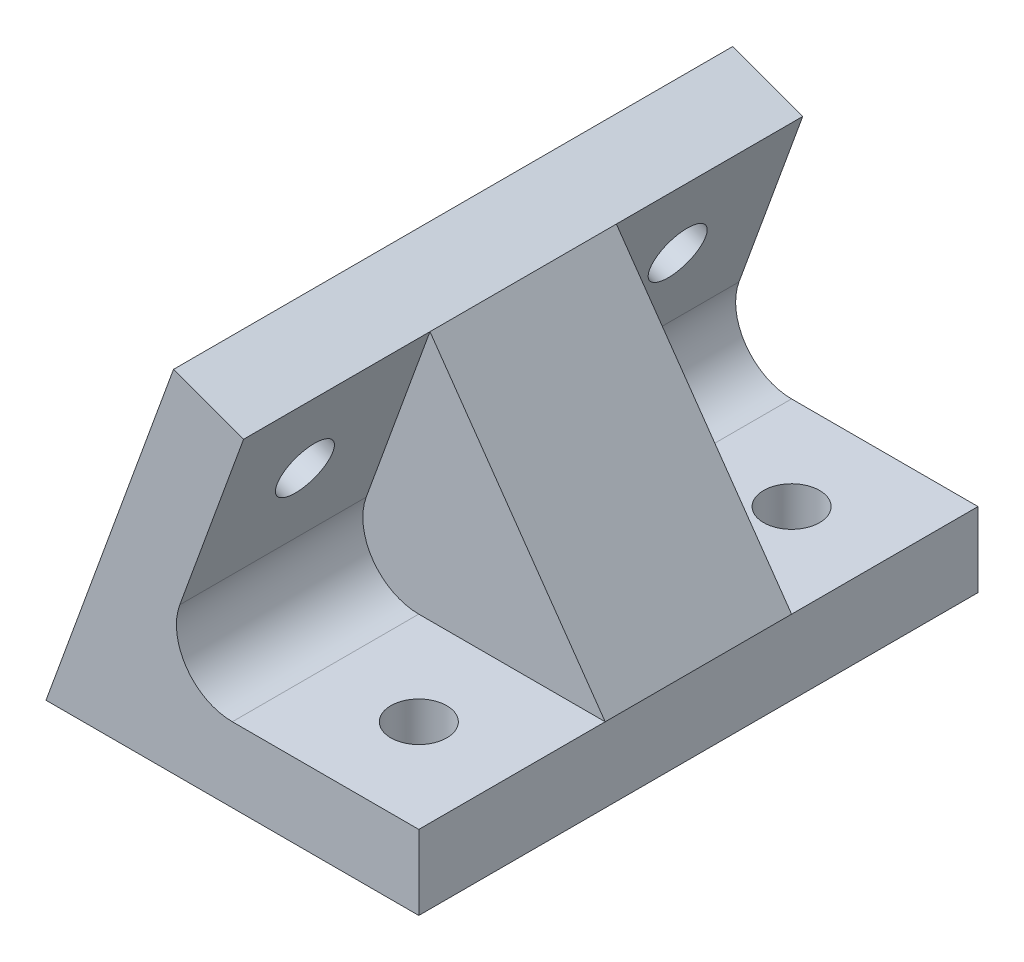
ISO-10303-21;
HEADER;
FILE_DESCRIPTION(('STEP AP214'),'2;1');
FILE_NAME('part.step','',(''),(''),'','','');
FILE_SCHEMA(('AUTOMOTIVE_DESIGN { 1 0 10303 214 1 1 1 1 }'));
ENDSEC;
DATA;
#1=APPLICATION_CONTEXT('core data for automotive mechanical design processes');
#2=APPLICATION_PROTOCOL_DEFINITION('international standard','automotive_design',2000,#1);
#3=PRODUCT_CONTEXT('',#1,'mechanical');
#4=PRODUCT('Part','Part','',(#3));
#5=PRODUCT_RELATED_PRODUCT_CATEGORY('part','',(#4));
#6=PRODUCT_DEFINITION_FORMATION('','',#4);
#7=PRODUCT_DEFINITION_CONTEXT('part definition',#1,'design');
#8=PRODUCT_DEFINITION('design','',#6,#7);
#9=PRODUCT_DEFINITION_SHAPE('','',#8);
#10=(LENGTH_UNIT() NAMED_UNIT(*) SI_UNIT(.MILLI.,.METRE.));
#11=(NAMED_UNIT(*) PLANE_ANGLE_UNIT() SI_UNIT($,.RADIAN.));
#12=(NAMED_UNIT(*) SI_UNIT($,.STERADIAN.) SOLID_ANGLE_UNIT());
#13=UNCERTAINTY_MEASURE_WITH_UNIT(LENGTH_MEASURE(1.E-05),#10,'distance_accuracy_value','');
#14=(GEOMETRIC_REPRESENTATION_CONTEXT(3) GLOBAL_UNCERTAINTY_ASSIGNED_CONTEXT((#13)) GLOBAL_UNIT_ASSIGNED_CONTEXT((#10,
#11,#12)) REPRESENTATION_CONTEXT('',''));
#15=CARTESIAN_POINT('',(0.,0.,0.));
#16=DIRECTION('',(0.,0.,1.));
#17=DIRECTION('',(1.,0.,0.));
#18=AXIS2_PLACEMENT_3D('',#15,#16,#17);
#19=CARTESIAN_POINT('',(20.,4.,30.));
#20=DIRECTION('',(0.,-1.,0.));
#21=DIRECTION('',(1.,0.,0.));
#22=AXIS2_PLACEMENT_3D('',#19,#20,#21);
#23=PLANE('',#22);
#24=CARTESIAN_POINT('',(15.,4.,5.));
#25=DIRECTION('',(0.,-1.,0.));
#26=DIRECTION('',(1.,0.,0.));
#27=AXIS2_PLACEMENT_3D('',#24,#25,#26);
#28=CIRCLE('',#27,1.5);
#29=CARTESIAN_POINT('',(16.5,4.,5.));
#30=VERTEX_POINT('',#29);
#31=EDGE_CURVE('E182',#30,#30,#28,.T.);
#32=ORIENTED_EDGE('',*,*,#31,.T.);
#33=EDGE_LOOP('',(#32));
#34=FACE_BOUND('',#33,.T.);
#35=DIRECTION('',(-1.,0.,0.));
#36=VECTOR('',#35,1.);
#37=CARTESIAN_POINT('',(20.,4.,0.));
#38=LINE('',#37,#36);
#39=CARTESIAN_POINT('',(20.,4.,0.));
#40=VERTEX_POINT('',#39);
#41=CARTESIAN_POINT('',(9.99703604719484,4.,0.));
#42=VERTEX_POINT('',#41);
#43=EDGE_CURVE('E222',#40,#42,#38,.T.);
#44=ORIENTED_EDGE('',*,*,#43,.T.);
#45=DIRECTION('',(0.,0.,-1.));
#46=VECTOR('',#45,1.);
#47=CARTESIAN_POINT('',(9.99703604719484,4.,10.));
#48=LINE('',#47,#46);
#49=CARTESIAN_POINT('',(9.99703604719484,4.,10.));
#50=VERTEX_POINT('',#49);
#51=EDGE_CURVE('E155',#42,#50,#48,.F.);
#52=ORIENTED_EDGE('',*,*,#51,.T.);
#53=DIRECTION('',(-1.,0.,0.));
#54=VECTOR('',#53,1.);
#55=CARTESIAN_POINT('',(20.,4.,10.));
#56=LINE('',#55,#54);
#57=CARTESIAN_POINT('',(20.,4.,10.));
#58=VERTEX_POINT('',#57);
#59=EDGE_CURVE('E144',#58,#50,#56,.T.);
#60=ORIENTED_EDGE('',*,*,#59,.F.);
#61=DIRECTION('',(0.,0.,-1.));
#62=VECTOR('',#61,1.);
#63=CARTESIAN_POINT('',(20.,4.,30.));
#64=LINE('',#63,#62);
#65=EDGE_CURVE('E152',#58,#40,#64,.T.);
#66=ORIENTED_EDGE('',*,*,#65,.T.);
#67=EDGE_LOOP('',(#44,#52,#60,#66));
#68=FACE_BOUND('',#67,.T.);
#69=ADVANCED_FACE('F39',(#34,#68),#23,.F.);
#70=CARTESIAN_POINT('',(5.71259202696848,4.,30.));
#71=DIRECTION('',(-0.939692620785907,0.342020143325673,0.));
#72=DIRECTION('',(-0.342020143325673,-0.939692620785907,0.));
#73=AXIS2_PLACEMENT_3D('',#70,#71,#72);
#74=PLANE('',#73);
#75=CARTESIAN_POINT('',(8.88907263302871,12.7273087384859,5.));
#76=DIRECTION('',(-0.939692620785907,0.342020143325673,0.));
#77=DIRECTION('',(-0.342020143325673,-0.939692620785907,0.));
#78=AXIS2_PLACEMENT_3D('',#75,#76,#77);
#79=CIRCLE('',#78,1.5);
#80=CARTESIAN_POINT('',(8.37604241804021,11.3177698073071,5.));
#81=VERTEX_POINT('',#80);
#82=EDGE_CURVE('E192',#81,#81,#79,.F.);
#83=ORIENTED_EDGE('',*,*,#82,.F.);
#84=EDGE_LOOP('',(#83));
#85=FACE_BOUND('',#84,.T.);
#86=DIRECTION('',(0.342020143325673,0.939692620785907,0.));
#87=VECTOR('',#86,1.);
#88=CARTESIAN_POINT('',(5.71259202696848,4.,10.));
#89=LINE('',#88,#87);
#90=CARTESIAN_POINT('',(7.17795818483712,8.02606042997701,10.));
#91=VERTEX_POINT('',#90);
#92=CARTESIAN_POINT('',(10.5991733496571,17.4257718424155,10.));
#93=VERTEX_POINT('',#92);
#94=EDGE_CURVE('E147',#91,#93,#89,.T.);
#95=ORIENTED_EDGE('',*,*,#94,.F.);
#96=DIRECTION('',(0.,0.,-1.));
#97=VECTOR('',#96,1.);
#98=CARTESIAN_POINT('',(7.17795818483712,8.02606042997701,0.));
#99=LINE('',#98,#97);
#100=CARTESIAN_POINT('',(7.17795818483712,8.02606042997701,0.));
#101=VERTEX_POINT('',#100);
#102=EDGE_CURVE('E181',#91,#101,#99,.T.);
#103=ORIENTED_EDGE('',*,*,#102,.T.);
#104=DIRECTION('',(0.342020143325673,0.939692620785907,0.));
#105=VECTOR('',#104,1.);
#106=CARTESIAN_POINT('',(5.71259202696848,4.,0.));
#107=LINE('',#106,#105);
#108=CARTESIAN_POINT('',(10.5991733496571,17.4257718424155,0.));
#109=VERTEX_POINT('',#108);
#110=EDGE_CURVE('E224',#101,#109,#107,.T.);
#111=ORIENTED_EDGE('',*,*,#110,.T.);
#112=DIRECTION('',(0.,0.,-1.));
#113=VECTOR('',#112,1.);
#114=CARTESIAN_POINT('',(10.5991733496571,17.4257718424155,30.));
#115=LINE('',#114,#113);
#116=EDGE_CURVE('E173',#93,#109,#115,.T.);
#117=ORIENTED_EDGE('',*,*,#116,.F.);
#118=EDGE_LOOP('',(#95,#103,#111,#117));
#119=FACE_BOUND('',#118,.T.);
#120=ADVANCED_FACE('F231',(#85,#119),#74,.F.);
#121=CARTESIAN_POINT('',(6.84040286651345,18.7938524157181,30.));
#122=DIRECTION('',(0.939692620785907,-0.342020143325672,0.));
#123=DIRECTION('',(0.342020143325672,0.939692620785907,0.));
#124=AXIS2_PLACEMENT_3D('',#121,#122,#123);
#125=PLANE('',#124);
#126=CARTESIAN_POINT('',(5.13030214988509,14.0953893117886,25.));
#127=DIRECTION('',(0.939692620785907,-0.342020143325672,0.));
#128=DIRECTION('',(0.,0.,-1.));
#129=AXIS2_PLACEMENT_3D('',#126,#127,#128);
#130=CIRCLE('',#129,1.5);
#131=CARTESIAN_POINT('',(5.13030214988509,14.0953893117886,23.5));
#132=VERTEX_POINT('',#131);
#133=EDGE_CURVE('E197',#132,#132,#130,.T.);
#134=ORIENTED_EDGE('',*,*,#133,.T.);
#135=EDGE_LOOP('',(#134));
#136=FACE_BOUND('',#135,.T.);
#137=DIRECTION('',(0.,0.,-1.));
#138=VECTOR('',#137,1.);
#139=CARTESIAN_POINT('',(6.84040286651345,18.7938524157181,30.));
#140=LINE('',#139,#138);
#141=CARTESIAN_POINT('',(6.84040286651345,18.7938524157181,30.));
#142=VERTEX_POINT('',#141);
#143=CARTESIAN_POINT('',(6.84040286651345,18.7938524157181,0.));
#144=VERTEX_POINT('',#143);
#145=EDGE_CURVE('E275',#142,#144,#140,.T.);
#146=ORIENTED_EDGE('',*,*,#145,.T.);
#147=DIRECTION('',(-0.342020143325672,-0.939692620785907,0.));
#148=VECTOR('',#147,1.);
#149=CARTESIAN_POINT('',(6.84040286651345,18.7938524157181,0.));
#150=LINE('',#149,#148);
#151=CARTESIAN_POINT('',(0.,0.,0.));
#152=VERTEX_POINT('',#151);
#153=EDGE_CURVE('E191',#144,#152,#150,.T.);
#154=ORIENTED_EDGE('',*,*,#153,.T.);
#155=DIRECTION('',(0.,0.,-1.));
#156=VECTOR('',#155,1.);
#157=CARTESIAN_POINT('',(0.,0.,30.));
#158=LINE('',#157,#156);
#159=CARTESIAN_POINT('',(0.,0.,30.));
#160=VERTEX_POINT('',#159);
#161=EDGE_CURVE('E178',#160,#152,#158,.T.);
#162=ORIENTED_EDGE('',*,*,#161,.F.);
#163=DIRECTION('',(-0.342020143325672,-0.939692620785907,0.));
#164=VECTOR('',#163,1.);
#165=CARTESIAN_POINT('',(6.84040286651345,18.7938524157181,30.));
#166=LINE('',#165,#164);
#167=EDGE_CURVE('E255',#142,#160,#166,.T.);
#168=ORIENTED_EDGE('',*,*,#167,.F.);
#169=EDGE_LOOP('',(#146,#154,#162,#168));
#170=FACE_BOUND('',#169,.T.);
#171=CARTESIAN_POINT('',(5.13030214988509,14.0953893117886,5.));
#172=DIRECTION('',(0.939692620785907,-0.342020143325672,0.));
#173=DIRECTION('',(0.,0.,1.));
#174=AXIS2_PLACEMENT_3D('',#171,#172,#173);
#175=CIRCLE('',#174,1.5);
#176=CARTESIAN_POINT('',(5.13030214988509,14.0953893117886,6.5));
#177=VERTEX_POINT('',#176);
#178=EDGE_CURVE('E137',#177,#177,#175,.T.);
#179=ORIENTED_EDGE('',*,*,#178,.T.);
#180=EDGE_LOOP('',(#179));
#181=FACE_BOUND('',#180,.T.);
#182=ADVANCED_FACE('F311',(#136,#170,#181),#125,.F.);
#183=CARTESIAN_POINT('',(0.,0.,30.));
#184=DIRECTION('',(0.,1.,0.));
#185=DIRECTION('',(0.,0.,1.));
#186=AXIS2_PLACEMENT_3D('',#183,#184,#185);
#187=PLANE('',#186);
#188=CARTESIAN_POINT('',(15.,0.,25.));
#189=DIRECTION('',(0.,-1.,0.));
#190=DIRECTION('',(0.,0.,-1.));
#191=AXIS2_PLACEMENT_3D('',#188,#189,#190);
#192=CIRCLE('',#191,1.5);
#193=CARTESIAN_POINT('',(15.,0.,23.5));
#194=VERTEX_POINT('',#193);
#195=EDGE_CURVE('E187',#194,#194,#192,.T.);
#196=ORIENTED_EDGE('',*,*,#195,.F.);
#197=EDGE_LOOP('',(#196));
#198=FACE_BOUND('',#197,.T.);
#199=ORIENTED_EDGE('',*,*,#161,.T.);
#200=DIRECTION('',(1.,0.,0.));
#201=VECTOR('',#200,1.);
#202=CARTESIAN_POINT('',(0.,0.,0.));
#203=LINE('',#202,#201);
#204=CARTESIAN_POINT('',(20.,0.,0.));
#205=VERTEX_POINT('',#204);
#206=EDGE_CURVE('E279',#152,#205,#203,.T.);
#207=ORIENTED_EDGE('',*,*,#206,.T.);
#208=DIRECTION('',(0.,0.,-1.));
#209=VECTOR('',#208,1.);
#210=CARTESIAN_POINT('',(20.,0.,30.));
#211=LINE('',#210,#209);
#212=CARTESIAN_POINT('',(20.,0.,30.));
#213=VERTEX_POINT('',#212);
#214=EDGE_CURVE('E169',#213,#205,#211,.T.);
#215=ORIENTED_EDGE('',*,*,#214,.F.);
#216=DIRECTION('',(1.,0.,0.));
#217=VECTOR('',#216,1.);
#218=CARTESIAN_POINT('',(0.,0.,30.));
#219=LINE('',#218,#217);
#220=EDGE_CURVE('E259',#160,#213,#219,.T.);
#221=ORIENTED_EDGE('',*,*,#220,.F.);
#222=EDGE_LOOP('',(#199,#207,#215,#221));
#223=FACE_BOUND('',#222,.T.);
#224=CARTESIAN_POINT('',(15.,0.,5.));
#225=DIRECTION('',(0.,-1.,0.));
#226=DIRECTION('',(0.,0.,1.));
#227=AXIS2_PLACEMENT_3D('',#224,#225,#226);
#228=CIRCLE('',#227,1.5);
#229=CARTESIAN_POINT('',(15.,0.,6.5));
#230=VERTEX_POINT('',#229);
#231=EDGE_CURVE('E201',#230,#230,#228,.T.);
#232=ORIENTED_EDGE('',*,*,#231,.F.);
#233=EDGE_LOOP('',(#232));
#234=FACE_BOUND('',#233,.T.);
#235=ADVANCED_FACE('F315',(#198,#223,#234),#187,.F.);
#236=CARTESIAN_POINT('',(20.,0.,30.));
#237=DIRECTION('',(-1.,0.,0.));
#238=DIRECTION('',(0.,0.,1.));
#239=AXIS2_PLACEMENT_3D('',#236,#237,#238);
#240=PLANE('',#239);
#241=ORIENTED_EDGE('',*,*,#214,.T.);
#242=DIRECTION('',(0.,1.,0.));
#243=VECTOR('',#242,1.);
#244=CARTESIAN_POINT('',(20.,0.,0.));
#245=LINE('',#244,#243);
#246=EDGE_CURVE('E161',#205,#40,#245,.T.);
#247=ORIENTED_EDGE('',*,*,#246,.T.);
#248=ORIENTED_EDGE('',*,*,#65,.F.);
#249=DIRECTION('',(0.,0.,-1.));
#250=VECTOR('',#249,1.);
#251=CARTESIAN_POINT('',(20.,4.,30.));
#252=LINE('',#251,#250);
#253=CARTESIAN_POINT('',(20.,4.,20.));
#254=VERTEX_POINT('',#253);
#255=EDGE_CURVE('E124',#58,#254,#252,.F.);
#256=ORIENTED_EDGE('',*,*,#255,.T.);
#257=CARTESIAN_POINT('',(20.,4.,30.));
#258=VERTEX_POINT('',#257);
#259=EDGE_CURVE('E164',#258,#254,#64,.T.);
#260=ORIENTED_EDGE('',*,*,#259,.F.);
#261=DIRECTION('',(0.,1.,0.));
#262=VECTOR('',#261,1.);
#263=CARTESIAN_POINT('',(20.,0.,30.));
#264=LINE('',#263,#262);
#265=EDGE_CURVE('E263',#213,#258,#264,.T.);
#266=ORIENTED_EDGE('',*,*,#265,.F.);
#267=EDGE_LOOP('',(#241,#247,#248,#256,#260,#266));
#268=FACE_BOUND('',#267,.T.);
#269=ADVANCED_FACE('F159',(#268),#240,.F.);
#270=CARTESIAN_POINT('',(15.,4.,25.));
#271=DIRECTION('',(0.,-1.,0.));
#272=DIRECTION('',(1.,0.,0.));
#273=AXIS2_PLACEMENT_3D('',#270,#271,#272);
#274=CIRCLE('',#273,1.5);
#275=CARTESIAN_POINT('',(16.5,4.,25.));
#276=VERTEX_POINT('',#275);
#277=EDGE_CURVE('E186',#276,#276,#274,.T.);
#278=ORIENTED_EDGE('',*,*,#277,.T.);
#279=EDGE_LOOP('',(#278));
#280=FACE_BOUND('',#279,.T.);
#281=DIRECTION('',(-1.,0.,0.));
#282=VECTOR('',#281,1.);
#283=CARTESIAN_POINT('',(20.,4.,20.));
#284=LINE('',#283,#282);
#285=CARTESIAN_POINT('',(9.99703604719484,4.,20.));
#286=VERTEX_POINT('',#285);
#287=EDGE_CURVE('E138',#254,#286,#284,.T.);
#288=ORIENTED_EDGE('',*,*,#287,.T.);
#289=DIRECTION('',(0.,0.,-1.));
#290=VECTOR('',#289,1.);
#291=CARTESIAN_POINT('',(9.99703604719484,4.,30.));
#292=LINE('',#291,#290);
#293=CARTESIAN_POINT('',(9.99703604719484,4.,30.));
#294=VERTEX_POINT('',#293);
#295=EDGE_CURVE('E55',#286,#294,#292,.F.);
#296=ORIENTED_EDGE('',*,*,#295,.T.);
#297=DIRECTION('',(-1.,0.,0.));
#298=VECTOR('',#297,1.);
#299=CARTESIAN_POINT('',(20.,4.,30.));
#300=LINE('',#299,#298);
#301=EDGE_CURVE('E266',#258,#294,#300,.T.);
#302=ORIENTED_EDGE('',*,*,#301,.F.);
#303=ORIENTED_EDGE('',*,*,#259,.T.);
#304=EDGE_LOOP('',(#288,#296,#302,#303));
#305=FACE_BOUND('',#304,.T.);
#306=ADVANCED_FACE('F300',(#280,#305),#23,.F.);
#307=CARTESIAN_POINT('',(8.88907263302871,12.7273087384859,25.));
#308=DIRECTION('',(-0.939692620785907,0.342020143325673,0.));
#309=DIRECTION('',(-0.342020143325673,-0.939692620785907,0.));
#310=AXIS2_PLACEMENT_3D('',#307,#308,#309);
#311=CIRCLE('',#310,1.5);
#312=CARTESIAN_POINT('',(8.37604241804021,11.3177698073071,25.));
#313=VERTEX_POINT('',#312);
#314=EDGE_CURVE('E196',#313,#313,#311,.F.);
#315=ORIENTED_EDGE('',*,*,#314,.F.);
#316=EDGE_LOOP('',(#315));
#317=FACE_BOUND('',#316,.T.);
#318=DIRECTION('',(0.342020143325673,0.939692620785907,0.));
#319=VECTOR('',#318,1.);
#320=CARTESIAN_POINT('',(5.71259202696848,4.,30.));
#321=LINE('',#320,#319);
#322=CARTESIAN_POINT('',(7.17795818483712,8.02606042997701,30.));
#323=VERTEX_POINT('',#322);
#324=CARTESIAN_POINT('',(10.5991733496571,17.4257718424155,30.));
#325=VERTEX_POINT('',#324);
#326=EDGE_CURVE('E269',#323,#325,#321,.T.);
#327=ORIENTED_EDGE('',*,*,#326,.F.);
#328=DIRECTION('',(0.,0.,-1.));
#329=VECTOR('',#328,1.);
#330=CARTESIAN_POINT('',(7.17795818483712,8.02606042997701,20.));
#331=LINE('',#330,#329);
#332=CARTESIAN_POINT('',(7.17795818483712,8.02606042997701,20.));
#333=VERTEX_POINT('',#332);
#334=EDGE_CURVE('E210',#323,#333,#331,.T.);
#335=ORIENTED_EDGE('',*,*,#334,.T.);
#336=DIRECTION('',(0.342020143325673,0.939692620785907,0.));
#337=VECTOR('',#336,1.);
#338=CARTESIAN_POINT('',(5.71259202696848,4.,20.));
#339=LINE('',#338,#337);
#340=CARTESIAN_POINT('',(10.5991733496571,17.4257718424155,20.));
#341=VERTEX_POINT('',#340);
#342=EDGE_CURVE('E157',#333,#341,#339,.T.);
#343=ORIENTED_EDGE('',*,*,#342,.T.);
#344=EDGE_CURVE('E165',#325,#341,#115,.T.);
#345=ORIENTED_EDGE('',*,*,#344,.F.);
#346=EDGE_LOOP('',(#327,#335,#343,#345));
#347=FACE_BOUND('',#346,.T.);
#348=ADVANCED_FACE('F308',(#317,#347),#74,.F.);
#349=CARTESIAN_POINT('',(10.5991733496571,17.4257718424155,30.));
#350=DIRECTION('',(-0.342020143325673,-0.939692620785907,0.));
#351=DIRECTION('',(0.939692620785907,-0.342020143325673,0.));
#352=AXIS2_PLACEMENT_3D('',#349,#350,#351);
#353=PLANE('',#352);
#354=ORIENTED_EDGE('',*,*,#344,.T.);
#355=EDGE_CURVE('E171',#341,#93,#115,.T.);
#356=ORIENTED_EDGE('',*,*,#355,.T.);
#357=ORIENTED_EDGE('',*,*,#116,.T.);
#358=DIRECTION('',(-0.939692620785907,0.342020143325673,0.));
#359=VECTOR('',#358,1.);
#360=CARTESIAN_POINT('',(10.5991733496571,17.4257718424155,0.));
#361=LINE('',#360,#359);
#362=EDGE_CURVE('E260',#109,#144,#361,.T.);
#363=ORIENTED_EDGE('',*,*,#362,.T.);
#364=ORIENTED_EDGE('',*,*,#145,.F.);
#365=DIRECTION('',(-0.939692620785907,0.342020143325673,0.));
#366=VECTOR('',#365,1.);
#367=CARTESIAN_POINT('',(10.5991733496571,17.4257718424155,30.));
#368=LINE('',#367,#366);
#369=EDGE_CURVE('E272',#325,#142,#368,.T.);
#370=ORIENTED_EDGE('',*,*,#369,.F.);
#371=EDGE_LOOP('',(#354,#356,#357,#363,#364,#370));
#372=FACE_BOUND('',#371,.T.);
#373=ADVANCED_FACE('F296',(#372),#353,.F.);
#374=CARTESIAN_POINT('',(0.,0.,30.));
#375=DIRECTION('',(0.,0.,-1.));
#376=DIRECTION('',(-1.,0.,0.));
#377=AXIS2_PLACEMENT_3D('',#374,#375,#376);
#378=PLANE('',#377);
#379=ORIENTED_EDGE('',*,*,#167,.T.);
#380=ORIENTED_EDGE('',*,*,#220,.T.);
#381=ORIENTED_EDGE('',*,*,#265,.T.);
#382=ORIENTED_EDGE('',*,*,#301,.T.);
#383=CARTESIAN_POINT('',(9.99703604719484,7.,30.));
#384=DIRECTION('',(0.,0.,-1.));
#385=DIRECTION('',(-1.,0.,0.));
#386=AXIS2_PLACEMENT_3D('',#383,#384,#385);
#387=CIRCLE('',#386,3.);
#388=EDGE_CURVE('E11',#294,#323,#387,.T.);
#389=ORIENTED_EDGE('',*,*,#388,.T.);
#390=ORIENTED_EDGE('',*,*,#326,.T.);
#391=ORIENTED_EDGE('',*,*,#369,.T.);
#392=EDGE_LOOP('',(#379,#380,#381,#382,#389,#390,#391));
#393=FACE_BOUND('',#392,.T.);
#394=ADVANCED_FACE('F306',(#393),#378,.F.);
#395=CARTESIAN_POINT('',(0.,0.,0.));
#396=DIRECTION('',(0.,0.,-1.));
#397=DIRECTION('',(-1.,0.,0.));
#398=AXIS2_PLACEMENT_3D('',#395,#396,#397);
#399=PLANE('',#398);
#400=ORIENTED_EDGE('',*,*,#153,.F.);
#401=ORIENTED_EDGE('',*,*,#362,.F.);
#402=ORIENTED_EDGE('',*,*,#110,.F.);
#403=CARTESIAN_POINT('',(9.99703604719484,7.,0.));
#404=DIRECTION('',(0.,0.,-1.));
#405=DIRECTION('',(-1.,0.,0.));
#406=AXIS2_PLACEMENT_3D('',#403,#404,#405);
#407=CIRCLE('',#406,3.);
#408=EDGE_CURVE('E48',#101,#42,#407,.F.);
#409=ORIENTED_EDGE('',*,*,#408,.T.);
#410=ORIENTED_EDGE('',*,*,#43,.F.);
#411=ORIENTED_EDGE('',*,*,#246,.F.);
#412=ORIENTED_EDGE('',*,*,#206,.F.);
#413=EDGE_LOOP('',(#400,#401,#402,#409,#410,#411,#412));
#414=FACE_BOUND('',#413,.T.);
#415=ADVANCED_FACE('F221',(#414),#399,.T.);
#416=CARTESIAN_POINT('',(15.,5.,5.));
#417=DIRECTION('',(0.,-1.,0.));
#418=DIRECTION('',(0.,0.,-1.));
#419=AXIS2_PLACEMENT_3D('',#416,#417,#418);
#420=CYLINDRICAL_SURFACE('',#419,1.5);
#421=ORIENTED_EDGE('',*,*,#231,.T.);
#422=EDGE_LOOP('',(#421));
#423=FACE_BOUND('',#422,.T.);
#424=ORIENTED_EDGE('',*,*,#31,.F.);
#425=EDGE_LOOP('',(#424));
#426=FACE_BOUND('',#425,.T.);
#427=ADVANCED_FACE('F323',(#423,#426),#420,.F.);
#428=CARTESIAN_POINT('',(15.,5.,25.));
#429=DIRECTION('',(0.,-1.,0.));
#430=DIRECTION('',(0.,0.,-1.));
#431=AXIS2_PLACEMENT_3D('',#428,#429,#430);
#432=CYLINDRICAL_SURFACE('',#431,1.5);
#433=ORIENTED_EDGE('',*,*,#195,.T.);
#434=EDGE_LOOP('',(#433));
#435=FACE_BOUND('',#434,.T.);
#436=ORIENTED_EDGE('',*,*,#277,.F.);
#437=EDGE_LOOP('',(#436));
#438=FACE_BOUND('',#437,.T.);
#439=ADVANCED_FACE('F326',(#435,#438),#432,.F.);
#440=CARTESIAN_POINT('',(9.82876525381462,12.3852885951602,5.));
#441=DIRECTION('',(-0.939692620785907,0.342020143325672,0.));
#442=DIRECTION('',(-0.342020143325672,-0.939692620785907,0.));
#443=AXIS2_PLACEMENT_3D('',#440,#441,#442);
#444=CYLINDRICAL_SURFACE('',#443,1.5);
#445=ORIENTED_EDGE('',*,*,#178,.F.);
#446=EDGE_LOOP('',(#445));
#447=FACE_BOUND('',#446,.T.);
#448=ORIENTED_EDGE('',*,*,#82,.T.);
#449=EDGE_LOOP('',(#448));
#450=FACE_BOUND('',#449,.T.);
#451=ADVANCED_FACE('F348',(#447,#450),#444,.F.);
#452=CARTESIAN_POINT('',(9.82876525381462,12.3852885951602,25.));
#453=DIRECTION('',(-0.939692620785907,0.342020143325672,0.));
#454=DIRECTION('',(-0.342020143325672,-0.939692620785907,0.));
#455=AXIS2_PLACEMENT_3D('',#452,#453,#454);
#456=CYLINDRICAL_SURFACE('',#455,1.5);
#457=ORIENTED_EDGE('',*,*,#133,.F.);
#458=EDGE_LOOP('',(#457));
#459=FACE_BOUND('',#458,.T.);
#460=ORIENTED_EDGE('',*,*,#314,.T.);
#461=EDGE_LOOP('',(#460));
#462=FACE_BOUND('',#461,.T.);
#463=ADVANCED_FACE('F354',(#459,#462),#456,.F.);
#464=CARTESIAN_POINT('',(10.5991733496571,17.4257718424155,15.));
#465=DIRECTION('',(-0.819152044288993,-0.573576436351045,0.));
#466=DIRECTION('',(0.573576436351045,-0.819152044288993,0.));
#467=AXIS2_PLACEMENT_3D('',#464,#465,#466);
#468=PLANE('',#467);
#469=ORIENTED_EDGE('',*,*,#255,.F.);
#470=DIRECTION('',(0.573576436351045,-0.819152044288993,0.));
#471=VECTOR('',#470,1.);
#472=CARTESIAN_POINT('',(10.5991733496571,17.4257718424155,10.));
#473=LINE('',#472,#471);
#474=EDGE_CURVE('E128',#93,#58,#473,.T.);
#475=ORIENTED_EDGE('',*,*,#474,.F.);
#476=ORIENTED_EDGE('',*,*,#355,.F.);
#477=DIRECTION('',(0.573576436351045,-0.819152044288993,0.));
#478=VECTOR('',#477,1.);
#479=CARTESIAN_POINT('',(10.5991733496571,17.4257718424155,20.));
#480=LINE('',#479,#478);
#481=EDGE_CURVE('E131',#341,#254,#480,.T.);
#482=ORIENTED_EDGE('',*,*,#481,.T.);
#483=EDGE_LOOP('',(#469,#475,#476,#482));
#484=FACE_BOUND('',#483,.T.);
#485=ADVANCED_FACE('F126',(#484),#468,.F.);
#486=CARTESIAN_POINT('',(10.,9.39692620785907,20.));
#487=DIRECTION('',(0.,0.,1.));
#488=DIRECTION('',(1.,0.,0.));
#489=AXIS2_PLACEMENT_3D('',#486,#487,#488);
#490=PLANE('',#489);
#491=ORIENTED_EDGE('',*,*,#342,.F.);
#492=CARTESIAN_POINT('',(9.99703604719484,7.,20.));
#493=DIRECTION('',(0.,0.,1.));
#494=DIRECTION('',(1.,0.,0.));
#495=AXIS2_PLACEMENT_3D('',#492,#493,#494);
#496=CIRCLE('',#495,3.);
#497=EDGE_CURVE('E63',#333,#286,#496,.T.);
#498=ORIENTED_EDGE('',*,*,#497,.T.);
#499=ORIENTED_EDGE('',*,*,#287,.F.);
#500=ORIENTED_EDGE('',*,*,#481,.F.);
#501=EDGE_LOOP('',(#491,#498,#499,#500));
#502=FACE_BOUND('',#501,.T.);
#503=ADVANCED_FACE('F299',(#502),#490,.T.);
#504=CARTESIAN_POINT('',(10.,9.39692620785907,10.));
#505=DIRECTION('',(0.,0.,1.));
#506=DIRECTION('',(1.,0.,0.));
#507=AXIS2_PLACEMENT_3D('',#504,#505,#506);
#508=PLANE('',#507);
#509=ORIENTED_EDGE('',*,*,#59,.T.);
#510=CARTESIAN_POINT('',(9.99703604719484,7.,10.));
#511=DIRECTION('',(0.,0.,1.));
#512=DIRECTION('',(1.,0.,0.));
#513=AXIS2_PLACEMENT_3D('',#510,#511,#512);
#514=CIRCLE('',#513,3.);
#515=EDGE_CURVE('E207',#50,#91,#514,.F.);
#516=ORIENTED_EDGE('',*,*,#515,.T.);
#517=ORIENTED_EDGE('',*,*,#94,.T.);
#518=ORIENTED_EDGE('',*,*,#474,.T.);
#519=EDGE_LOOP('',(#509,#516,#517,#518));
#520=FACE_BOUND('',#519,.T.);
#521=ADVANCED_FACE('F143',(#520),#508,.F.);
#522=CARTESIAN_POINT('',(9.99703604719484,7.,30.));
#523=DIRECTION('',(0.,0.,1.));
#524=DIRECTION('',(1.,0.,0.));
#525=AXIS2_PLACEMENT_3D('',#522,#523,#524);
#526=CYLINDRICAL_SURFACE('',#525,3.);
#527=ORIENTED_EDGE('',*,*,#515,.F.);
#528=ORIENTED_EDGE('',*,*,#51,.F.);
#529=ORIENTED_EDGE('',*,*,#408,.F.);
#530=ORIENTED_EDGE('',*,*,#102,.F.);
#531=EDGE_LOOP('',(#527,#528,#529,#530));
#532=FACE_BOUND('',#531,.T.);
#533=ADVANCED_FACE('F229',(#532),#526,.F.);
#534=CARTESIAN_POINT('',(9.99703604719484,7.,30.));
#535=DIRECTION('',(0.,0.,1.));
#536=DIRECTION('',(1.,0.,0.));
#537=AXIS2_PLACEMENT_3D('',#534,#535,#536);
#538=CYLINDRICAL_SURFACE('',#537,3.);
#539=ORIENTED_EDGE('',*,*,#388,.F.);
#540=ORIENTED_EDGE('',*,*,#295,.F.);
#541=ORIENTED_EDGE('',*,*,#497,.F.);
#542=ORIENTED_EDGE('',*,*,#334,.F.);
#543=EDGE_LOOP('',(#539,#540,#541,#542));
#544=FACE_BOUND('',#543,.T.);
#545=ADVANCED_FACE('F41',(#544),#538,.F.);
#546=CLOSED_SHELL('',(#69,#120,#182,#235,#269,#306,#348,#373,#394,#415,#427,#439,#451,#463,#485,
#503,#521,#533,#545));
#547=MANIFOLD_SOLID_BREP('B2',#546);
#548=ADVANCED_BREP_SHAPE_REPRESENTATION('',(#18,#547),#14);
#549=SHAPE_DEFINITION_REPRESENTATION(#9,#548);
ENDSEC;
END-ISO-10303-21;
